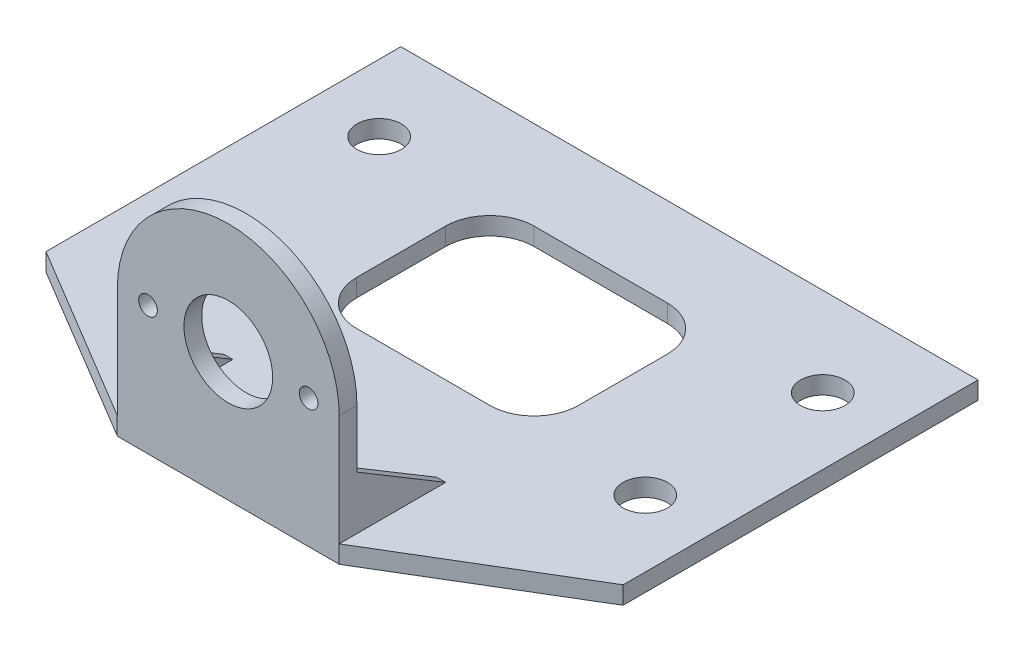
ISO-10303-21;
HEADER;
FILE_DESCRIPTION(('STEP AP214'),'2;1');
FILE_NAME('part.step','',(''),(''),'','','');
FILE_SCHEMA(('AUTOMOTIVE_DESIGN { 1 0 10303 214 1 1 1 1 }'));
ENDSEC;
DATA;
#1=APPLICATION_CONTEXT('core data for automotive mechanical design processes');
#2=APPLICATION_PROTOCOL_DEFINITION('international standard','automotive_design',2000,#1);
#3=PRODUCT_CONTEXT('',#1,'mechanical');
#4=PRODUCT('Part','Part','',(#3));
#5=PRODUCT_RELATED_PRODUCT_CATEGORY('part','',(#4));
#6=PRODUCT_DEFINITION_FORMATION('','',#4);
#7=PRODUCT_DEFINITION_CONTEXT('part definition',#1,'design');
#8=PRODUCT_DEFINITION('design','',#6,#7);
#9=PRODUCT_DEFINITION_SHAPE('','',#8);
#10=(LENGTH_UNIT() NAMED_UNIT(*) SI_UNIT(.MILLI.,.METRE.));
#11=(NAMED_UNIT(*) PLANE_ANGLE_UNIT() SI_UNIT($,.RADIAN.));
#12=(NAMED_UNIT(*) SI_UNIT($,.STERADIAN.) SOLID_ANGLE_UNIT());
#13=UNCERTAINTY_MEASURE_WITH_UNIT(LENGTH_MEASURE(1.E-05),#10,'distance_accuracy_value','');
#14=(GEOMETRIC_REPRESENTATION_CONTEXT(3) GLOBAL_UNCERTAINTY_ASSIGNED_CONTEXT((#13)) GLOBAL_UNIT_ASSIGNED_CONTEXT((#10,
#11,#12)) REPRESENTATION_CONTEXT('',''));
#15=CARTESIAN_POINT('',(0.,0.,0.));
#16=DIRECTION('',(0.,0.,1.));
#17=DIRECTION('',(1.,0.,0.));
#18=AXIS2_PLACEMENT_3D('',#15,#16,#17);
#19=CARTESIAN_POINT('',(0.,0.,0.));
#20=DIRECTION('',(0.,0.,1.));
#21=DIRECTION('',(1.,0.,0.));
#22=AXIS2_PLACEMENT_3D('',#19,#20,#21);
#23=PLANE('',#22);
#24=DIRECTION('',(0.,-1.,0.));
#25=VECTOR('',#24,1.);
#26=CARTESIAN_POINT('',(-11.5,-12.5,0.));
#27=LINE('',#26,#25);
#28=CARTESIAN_POINT('',(-11.5,-6.5,0.));
#29=VERTEX_POINT('',#28);
#30=CARTESIAN_POINT('',(-11.5,-12.5,0.));
#31=VERTEX_POINT('',#30);
#32=EDGE_CURVE('E278',#29,#31,#27,.T.);
#33=ORIENTED_EDGE('',*,*,#32,.F.);
#34=DIRECTION('',(1.,0.,0.));
#35=VECTOR('',#34,1.);
#36=CARTESIAN_POINT('',(-12.5,-6.5,0.));
#37=LINE('',#36,#35);
#38=CARTESIAN_POINT('',(-12.5,-6.5,0.));
#39=VERTEX_POINT('',#38);
#40=EDGE_CURVE('E273',#39,#29,#37,.T.);
#41=ORIENTED_EDGE('',*,*,#40,.F.);
#42=DIRECTION('',(0.,-1.,0.));
#43=VECTOR('',#42,1.);
#44=CARTESIAN_POINT('',(-12.5,0.,0.));
#45=LINE('',#44,#43);
#46=CARTESIAN_POINT('',(-12.5,0.,0.));
#47=VERTEX_POINT('',#46);
#48=EDGE_CURVE('E358',#47,#39,#45,.T.);
#49=ORIENTED_EDGE('',*,*,#48,.F.);
#50=CARTESIAN_POINT('',(0.,0.,0.));
#51=DIRECTION('',(0.,0.,1.));
#52=DIRECTION('',(1.,0.,0.));
#53=AXIS2_PLACEMENT_3D('',#50,#51,#52);
#54=CIRCLE('',#53,12.5);
#55=CARTESIAN_POINT('',(12.5,0.,0.));
#56=VERTEX_POINT('',#55);
#57=EDGE_CURVE('E380',#56,#47,#54,.T.);
#58=ORIENTED_EDGE('',*,*,#57,.F.);
#59=DIRECTION('',(0.,1.,0.));
#60=VECTOR('',#59,1.);
#61=CARTESIAN_POINT('',(12.5,0.,0.));
#62=LINE('',#61,#60);
#63=CARTESIAN_POINT('',(12.5,-6.5,0.));
#64=VERTEX_POINT('',#63);
#65=EDGE_CURVE('E370',#64,#56,#62,.T.);
#66=ORIENTED_EDGE('',*,*,#65,.F.);
#67=DIRECTION('',(1.,0.,0.));
#68=VECTOR('',#67,1.);
#69=CARTESIAN_POINT('',(12.5,-6.5,0.));
#70=LINE('',#69,#68);
#71=CARTESIAN_POINT('',(11.5,-6.5,0.));
#72=VERTEX_POINT('',#71);
#73=EDGE_CURVE('E268',#72,#64,#70,.T.);
#74=ORIENTED_EDGE('',*,*,#73,.F.);
#75=DIRECTION('',(0.,1.,0.));
#76=VECTOR('',#75,1.);
#77=CARTESIAN_POINT('',(11.5,-12.5,0.));
#78=LINE('',#77,#76);
#79=CARTESIAN_POINT('',(11.5,-12.5,0.));
#80=VERTEX_POINT('',#79);
#81=EDGE_CURVE('E263',#80,#72,#78,.T.);
#82=ORIENTED_EDGE('',*,*,#81,.F.);
#83=DIRECTION('',(1.,0.,0.));
#84=VECTOR('',#83,1.);
#85=CARTESIAN_POINT('',(0.,-12.5,0.));
#86=LINE('',#85,#84);
#87=EDGE_CURVE('E366',#31,#80,#86,.T.);
#88=ORIENTED_EDGE('',*,*,#87,.F.);
#89=EDGE_LOOP('',(#33,#41,#49,#58,#66,#74,#82,#88));
#90=FACE_BOUND('',#89,.T.);
#91=CARTESIAN_POINT('',(0.,0.,0.));
#92=DIRECTION('',(0.,0.,1.));
#93=DIRECTION('',(1.,0.,0.));
#94=AXIS2_PLACEMENT_3D('',#91,#92,#93);
#95=CIRCLE('',#94,5.);
#96=CARTESIAN_POINT('',(5.,0.,0.));
#97=VERTEX_POINT('',#96);
#98=EDGE_CURVE('E496',#97,#97,#95,.T.);
#99=ORIENTED_EDGE('',*,*,#98,.T.);
#100=EDGE_LOOP('',(#99));
#101=FACE_BOUND('',#100,.T.);
#102=CARTESIAN_POINT('',(-9.05,0.,0.));
#103=DIRECTION('',(0.,0.,1.));
#104=DIRECTION('',(1.,0.,0.));
#105=AXIS2_PLACEMENT_3D('',#102,#103,#104);
#106=CIRCLE('',#105,1.05);
#107=CARTESIAN_POINT('',(-8.,0.,0.));
#108=VERTEX_POINT('',#107);
#109=EDGE_CURVE('E482',#108,#108,#106,.T.);
#110=ORIENTED_EDGE('',*,*,#109,.T.);
#111=EDGE_LOOP('',(#110));
#112=FACE_BOUND('',#111,.T.);
#113=CARTESIAN_POINT('',(9.05,0.,0.));
#114=DIRECTION('',(0.,0.,1.));
#115=DIRECTION('',(1.,0.,0.));
#116=AXIS2_PLACEMENT_3D('',#113,#114,#115);
#117=CIRCLE('',#116,1.05);
#118=CARTESIAN_POINT('',(10.1,0.,0.));
#119=VERTEX_POINT('',#118);
#120=EDGE_CURVE('E490',#119,#119,#117,.T.);
#121=ORIENTED_EDGE('',*,*,#120,.T.);
#122=EDGE_LOOP('',(#121));
#123=FACE_BOUND('',#122,.T.);
#124=ADVANCED_FACE('F52',(#90,#101,#112,#123),#23,.F.);
#125=CARTESIAN_POINT('',(12.5,-12.5,2.));
#126=DIRECTION('',(0.,1.,0.));
#127=DIRECTION('',(0.,0.,1.));
#128=AXIS2_PLACEMENT_3D('',#125,#126,#127);
#129=PLANE('',#128);
#130=CARTESIAN_POINT('',(-7.52457031976064,-12.5,-35.));
#131=DIRECTION('',(0.,1.,0.));
#132=DIRECTION('',(0.,0.,-1.));
#133=AXIS2_PLACEMENT_3D('',#130,#131,#132);
#134=CIRCLE('',#133,5.);
#135=CARTESIAN_POINT('',(-7.52457031976061,-12.5,-40.));
#136=VERTEX_POINT('',#135);
#137=CARTESIAN_POINT('',(-12.5245703197606,-12.5,-35.));
#138=VERTEX_POINT('',#137);
#139=EDGE_CURVE('E67',#136,#138,#134,.T.);
#140=ORIENTED_EDGE('',*,*,#139,.F.);
#141=DIRECTION('',(-1.,0.,0.));
#142=VECTOR('',#141,1.);
#143=CARTESIAN_POINT('',(7.47542968023932,-12.5,-40.));
#144=LINE('',#143,#142);
#145=CARTESIAN_POINT('',(7.47542968023932,-12.5,-40.));
#146=VERTEX_POINT('',#145);
#147=EDGE_CURVE('E237',#146,#136,#144,.T.);
#148=ORIENTED_EDGE('',*,*,#147,.F.);
#149=CARTESIAN_POINT('',(7.47542968023936,-12.5,-35.));
#150=DIRECTION('',(0.,1.,0.));
#151=DIRECTION('',(0.,0.,1.));
#152=AXIS2_PLACEMENT_3D('',#149,#150,#151);
#153=CIRCLE('',#152,5.);
#154=CARTESIAN_POINT('',(12.4754296802394,-12.5,-35.));
#155=VERTEX_POINT('',#154);
#156=EDGE_CURVE('E234',#155,#146,#153,.T.);
#157=ORIENTED_EDGE('',*,*,#156,.F.);
#158=DIRECTION('',(0.,0.,-1.));
#159=VECTOR('',#158,1.);
#160=CARTESIAN_POINT('',(12.4754296802394,-12.5,-35.));
#161=LINE('',#160,#159);
#162=CARTESIAN_POINT('',(12.4754296802394,-12.5,-25.));
#163=VERTEX_POINT('',#162);
#164=EDGE_CURVE('E231',#163,#155,#161,.T.);
#165=ORIENTED_EDGE('',*,*,#164,.F.);
#166=CARTESIAN_POINT('',(7.47542968023936,-12.5,-25.));
#167=DIRECTION('',(0.,1.,0.));
#168=DIRECTION('',(0.,0.,1.));
#169=AXIS2_PLACEMENT_3D('',#166,#167,#168);
#170=CIRCLE('',#169,5.);
#171=CARTESIAN_POINT('',(7.47542968023933,-12.5,-20.));
#172=VERTEX_POINT('',#171);
#173=EDGE_CURVE('E225',#172,#163,#170,.T.);
#174=ORIENTED_EDGE('',*,*,#173,.F.);
#175=DIRECTION('',(1.,0.,0.));
#176=VECTOR('',#175,1.);
#177=CARTESIAN_POINT('',(7.47542968023933,-12.5,-20.));
#178=LINE('',#177,#176);
#179=CARTESIAN_POINT('',(-7.5245703197606,-12.5,-20.));
#180=VERTEX_POINT('',#179);
#181=EDGE_CURVE('E223',#180,#172,#178,.T.);
#182=ORIENTED_EDGE('',*,*,#181,.F.);
#183=CARTESIAN_POINT('',(-7.52457031976064,-12.5,-25.));
#184=DIRECTION('',(0.,1.,0.));
#185=DIRECTION('',(0.,0.,-1.));
#186=AXIS2_PLACEMENT_3D('',#183,#184,#185);
#187=CIRCLE('',#186,5.);
#188=CARTESIAN_POINT('',(-12.5245703197606,-12.5,-25.));
#189=VERTEX_POINT('',#188);
#190=EDGE_CURVE('E206',#189,#180,#187,.T.);
#191=ORIENTED_EDGE('',*,*,#190,.F.);
#192=DIRECTION('',(0.,0.,1.));
#193=VECTOR('',#192,1.);
#194=CARTESIAN_POINT('',(-12.5245703197606,-12.5,-35.));
#195=LINE('',#194,#193);
#196=EDGE_CURVE('E215',#138,#189,#195,.T.);
#197=ORIENTED_EDGE('',*,*,#196,.F.);
#198=EDGE_LOOP('',(#140,#148,#157,#165,#174,#182,#191,#197));
#199=FACE_BOUND('',#198,.T.);
#200=DIRECTION('',(0.857492925712544,0.,-0.514495755427526));
#201=VECTOR('',#200,1.);
#202=CARTESIAN_POINT('',(12.5,-12.5,2.));
#203=LINE('',#202,#201);
#204=CARTESIAN_POINT('',(12.5,-12.5,2.));
#205=VERTEX_POINT('',#204);
#206=CARTESIAN_POINT('',(32.5,-12.5,-10.));
#207=VERTEX_POINT('',#206);
#208=EDGE_CURVE('E310',#205,#207,#203,.T.);
#209=ORIENTED_EDGE('',*,*,#208,.T.);
#210=DIRECTION('',(0.,0.,-1.));
#211=VECTOR('',#210,1.);
#212=CARTESIAN_POINT('',(32.5,-12.5,-50.));
#213=LINE('',#212,#211);
#214=CARTESIAN_POINT('',(32.5,-12.5,-50.));
#215=VERTEX_POINT('',#214);
#216=EDGE_CURVE('E304',#207,#215,#213,.T.);
#217=ORIENTED_EDGE('',*,*,#216,.T.);
#218=DIRECTION('',(1.,0.,0.));
#219=VECTOR('',#218,1.);
#220=CARTESIAN_POINT('',(12.5,-12.5,-50.));
#221=LINE('',#220,#219);
#222=CARTESIAN_POINT('',(-32.5491406395213,-12.5,-50.));
#223=VERTEX_POINT('',#222);
#224=EDGE_CURVE('E338',#223,#215,#221,.T.);
#225=ORIENTED_EDGE('',*,*,#224,.F.);
#226=DIRECTION('',(0.,0.,1.));
#227=VECTOR('',#226,1.);
#228=CARTESIAN_POINT('',(-32.5491406395213,-12.5,-50.));
#229=LINE('',#228,#227);
#230=CARTESIAN_POINT('',(-32.5491406395213,-12.5,-10.));
#231=VERTEX_POINT('',#230);
#232=EDGE_CURVE('E324',#223,#231,#229,.T.);
#233=ORIENTED_EDGE('',*,*,#232,.T.);
#234=DIRECTION('',(0.858049123183599,0.,0.513567621841424));
#235=VECTOR('',#234,1.);
#236=CARTESIAN_POINT('',(-12.5,-12.5,2.));
#237=LINE('',#236,#235);
#238=CARTESIAN_POINT('',(-12.5491406395213,-12.5,1.97058788279968));
#239=VERTEX_POINT('',#238);
#240=EDGE_CURVE('E321',#231,#239,#237,.T.);
#241=ORIENTED_EDGE('',*,*,#240,.T.);
#242=DIRECTION('',(0.,0.,-1.));
#243=VECTOR('',#242,1.);
#244=CARTESIAN_POINT('',(-12.5491406395213,-12.5,2.));
#245=LINE('',#244,#243);
#246=CARTESIAN_POINT('',(-12.5491406395213,-12.5,2.));
#247=VERTEX_POINT('',#246);
#248=EDGE_CURVE('E348',#247,#239,#245,.T.);
#249=ORIENTED_EDGE('',*,*,#248,.F.);
#250=DIRECTION('',(1.,0.,0.));
#251=VECTOR('',#250,1.);
#252=CARTESIAN_POINT('',(12.5,-12.5,2.));
#253=LINE('',#252,#251);
#254=CARTESIAN_POINT('',(-12.5,-12.5,2.));
#255=VERTEX_POINT('',#254);
#256=EDGE_CURVE('E345',#247,#255,#253,.T.);
#257=ORIENTED_EDGE('',*,*,#256,.T.);
#258=DIRECTION('',(0.,0.,1.));
#259=VECTOR('',#258,1.);
#260=CARTESIAN_POINT('',(-12.5,-12.5,0.));
#261=LINE('',#260,#259);
#262=CARTESIAN_POINT('',(-12.5,-12.5,-10.));
#263=VERTEX_POINT('',#262);
#264=EDGE_CURVE('E357',#263,#255,#261,.T.);
#265=ORIENTED_EDGE('',*,*,#264,.F.);
#266=DIRECTION('',(-1.,0.,0.));
#267=VECTOR('',#266,1.);
#268=CARTESIAN_POINT('',(-12.5,-12.5,-10.));
#269=LINE('',#268,#267);
#270=CARTESIAN_POINT('',(-11.5,-12.5,-10.));
#271=VERTEX_POINT('',#270);
#272=EDGE_CURVE('E274',#271,#263,#269,.T.);
#273=ORIENTED_EDGE('',*,*,#272,.F.);
#274=DIRECTION('',(0.,0.,1.));
#275=VECTOR('',#274,1.);
#276=CARTESIAN_POINT('',(-11.5,-12.5,-10.));
#277=LINE('',#276,#275);
#278=EDGE_CURVE('E277',#271,#31,#277,.T.);
#279=ORIENTED_EDGE('',*,*,#278,.T.);
#280=ORIENTED_EDGE('',*,*,#87,.T.);
#281=DIRECTION('',(0.,0.,1.));
#282=VECTOR('',#281,1.);
#283=CARTESIAN_POINT('',(11.5,-12.5,-10.));
#284=LINE('',#283,#282);
#285=CARTESIAN_POINT('',(11.5,-12.5,-10.));
#286=VERTEX_POINT('',#285);
#287=EDGE_CURVE('E267',#286,#80,#284,.T.);
#288=ORIENTED_EDGE('',*,*,#287,.F.);
#289=DIRECTION('',(-1.,0.,0.));
#290=VECTOR('',#289,1.);
#291=CARTESIAN_POINT('',(12.5,-12.5,-10.));
#292=LINE('',#291,#290);
#293=CARTESIAN_POINT('',(12.5,-12.5,-10.));
#294=VERTEX_POINT('',#293);
#295=EDGE_CURVE('E264',#294,#286,#292,.T.);
#296=ORIENTED_EDGE('',*,*,#295,.F.);
#297=DIRECTION('',(0.,0.,1.));
#298=VECTOR('',#297,1.);
#299=CARTESIAN_POINT('',(12.5,-12.5,2.));
#300=LINE('',#299,#298);
#301=EDGE_CURVE('E313',#294,#205,#300,.T.);
#302=ORIENTED_EDGE('',*,*,#301,.T.);
#303=EDGE_LOOP('',(#209,#217,#225,#233,#241,#249,#257,#265,#273,#279,#280,#288,#296,#302));
#304=FACE_BOUND('',#303,.T.);
#305=CARTESIAN_POINT('',(-25.,-12.5,-20.));
#306=DIRECTION('',(0.,1.,0.));
#307=DIRECTION('',(0.,0.,1.));
#308=AXIS2_PLACEMENT_3D('',#305,#306,#307);
#309=CIRCLE('',#308,2.5);
#310=CARTESIAN_POINT('',(-25.,-12.5,-17.5));
#311=VERTEX_POINT('',#310);
#312=EDGE_CURVE('E296',#311,#311,#309,.T.);
#313=ORIENTED_EDGE('',*,*,#312,.F.);
#314=EDGE_LOOP('',(#313));
#315=FACE_BOUND('',#314,.T.);
#316=CARTESIAN_POINT('',(-25.,-12.5,-40.));
#317=DIRECTION('',(0.,1.,0.));
#318=DIRECTION('',(0.,0.,1.));
#319=AXIS2_PLACEMENT_3D('',#316,#317,#318);
#320=CIRCLE('',#319,2.5);
#321=CARTESIAN_POINT('',(-25.,-12.5,-37.5));
#322=VERTEX_POINT('',#321);
#323=EDGE_CURVE('E292',#322,#322,#320,.T.);
#324=ORIENTED_EDGE('',*,*,#323,.F.);
#325=EDGE_LOOP('',(#324));
#326=FACE_BOUND('',#325,.T.);
#327=CARTESIAN_POINT('',(25.,-12.5,-40.));
#328=DIRECTION('',(0.,1.,0.));
#329=DIRECTION('',(0.,0.,-1.));
#330=AXIS2_PLACEMENT_3D('',#327,#328,#329);
#331=CIRCLE('',#330,2.5);
#332=CARTESIAN_POINT('',(25.,-12.5,-42.5));
#333=VERTEX_POINT('',#332);
#334=EDGE_CURVE('E288',#333,#333,#331,.T.);
#335=ORIENTED_EDGE('',*,*,#334,.F.);
#336=EDGE_LOOP('',(#335));
#337=FACE_BOUND('',#336,.T.);
#338=CARTESIAN_POINT('',(25.,-12.5,-20.));
#339=DIRECTION('',(0.,1.,0.));
#340=DIRECTION('',(0.,0.,-1.));
#341=AXIS2_PLACEMENT_3D('',#338,#339,#340);
#342=CIRCLE('',#341,2.5);
#343=CARTESIAN_POINT('',(25.,-12.5,-22.5));
#344=VERTEX_POINT('',#343);
#345=EDGE_CURVE('E284',#344,#344,#342,.T.);
#346=ORIENTED_EDGE('',*,*,#345,.F.);
#347=EDGE_LOOP('',(#346));
#348=FACE_BOUND('',#347,.T.);
#349=ADVANCED_FACE('F219',(#199,#304,#315,#326,#337,#348),#129,.T.);
#350=CARTESIAN_POINT('',(12.5,0.,0.));
#351=DIRECTION('',(1.,0.,0.));
#352=DIRECTION('',(0.,0.,-1.));
#353=AXIS2_PLACEMENT_3D('',#350,#351,#352);
#354=PLANE('',#353);
#355=DIRECTION('',(0.,-0.514495755427526,-0.857492925712544));
#356=VECTOR('',#355,1.);
#357=CARTESIAN_POINT('',(12.5,-4.77941176470588,2.86764705882353));
#358=LINE('',#357,#356);
#359=EDGE_CURVE('E260',#64,#294,#358,.T.);
#360=ORIENTED_EDGE('',*,*,#359,.F.);
#361=ORIENTED_EDGE('',*,*,#65,.T.);
#362=DIRECTION('',(0.,0.,1.));
#363=VECTOR('',#362,1.);
#364=CARTESIAN_POINT('',(12.5,0.,0.));
#365=LINE('',#364,#363);
#366=CARTESIAN_POINT('',(12.5,0.,2.));
#367=VERTEX_POINT('',#366);
#368=EDGE_CURVE('E374',#56,#367,#365,.T.);
#369=ORIENTED_EDGE('',*,*,#368,.T.);
#370=DIRECTION('',(0.,1.,0.));
#371=VECTOR('',#370,1.);
#372=CARTESIAN_POINT('',(12.5,0.,2.));
#373=LINE('',#372,#371);
#374=EDGE_CURVE('E387',#205,#367,#373,.T.);
#375=ORIENTED_EDGE('',*,*,#374,.F.);
#376=ORIENTED_EDGE('',*,*,#301,.F.);
#377=EDGE_LOOP('',(#360,#361,#369,#375,#376));
#378=FACE_BOUND('',#377,.T.);
#379=ADVANCED_FACE('F476',(#378),#354,.T.);
#380=CARTESIAN_POINT('',(0.,0.,2.));
#381=DIRECTION('',(0.,0.,-1.));
#382=DIRECTION('',(-1.,0.,0.));
#383=AXIS2_PLACEMENT_3D('',#380,#381,#382);
#384=CYLINDRICAL_SURFACE('',#383,12.5);
#385=DIRECTION('',(0.,0.,1.));
#386=VECTOR('',#385,1.);
#387=CARTESIAN_POINT('',(-12.5,0.,0.));
#388=LINE('',#387,#386);
#389=CARTESIAN_POINT('',(-12.5,0.,2.));
#390=VERTEX_POINT('',#389);
#391=EDGE_CURVE('E354',#47,#390,#388,.T.);
#392=ORIENTED_EDGE('',*,*,#391,.T.);
#393=CARTESIAN_POINT('',(0.,0.,2.));
#394=DIRECTION('',(0.,0.,1.));
#395=DIRECTION('',(1.,0.,0.));
#396=AXIS2_PLACEMENT_3D('',#393,#394,#395);
#397=CIRCLE('',#396,12.5);
#398=EDGE_CURVE('E449',#367,#390,#397,.T.);
#399=ORIENTED_EDGE('',*,*,#398,.F.);
#400=ORIENTED_EDGE('',*,*,#368,.F.);
#401=ORIENTED_EDGE('',*,*,#57,.T.);
#402=EDGE_LOOP('',(#392,#399,#400,#401));
#403=FACE_BOUND('',#402,.T.);
#404=ADVANCED_FACE('F54',(#403),#384,.T.);
#405=CARTESIAN_POINT('',(0.,0.,2.));
#406=DIRECTION('',(0.,0.,1.));
#407=DIRECTION('',(1.,0.,0.));
#408=AXIS2_PLACEMENT_3D('',#405,#406,#407);
#409=PLANE('',#408);
#410=DIRECTION('',(0.,1.,0.));
#411=VECTOR('',#410,1.);
#412=CARTESIAN_POINT('',(-12.5491406395213,-12.5,2.));
#413=LINE('',#412,#411);
#414=CARTESIAN_POINT('',(-12.5491406395213,-14.5,2.));
#415=VERTEX_POINT('',#414);
#416=EDGE_CURVE('E342',#415,#247,#413,.T.);
#417=ORIENTED_EDGE('',*,*,#416,.F.);
#418=DIRECTION('',(-1.,0.,0.));
#419=VECTOR('',#418,1.);
#420=CARTESIAN_POINT('',(12.5,-14.5,2.));
#421=LINE('',#420,#419);
#422=CARTESIAN_POINT('',(12.5,-14.5,2.));
#423=VERTEX_POINT('',#422);
#424=EDGE_CURVE('E340',#423,#415,#421,.T.);
#425=ORIENTED_EDGE('',*,*,#424,.F.);
#426=EDGE_CURVE('E363',#423,#205,#373,.T.);
#427=ORIENTED_EDGE('',*,*,#426,.T.);
#428=ORIENTED_EDGE('',*,*,#374,.T.);
#429=ORIENTED_EDGE('',*,*,#398,.T.);
#430=DIRECTION('',(0.,-1.,0.));
#431=VECTOR('',#430,1.);
#432=CARTESIAN_POINT('',(-12.5,0.,2.));
#433=LINE('',#432,#431);
#434=EDGE_CURVE('E356',#390,#255,#433,.T.);
#435=ORIENTED_EDGE('',*,*,#434,.T.);
#436=ORIENTED_EDGE('',*,*,#256,.F.);
#437=EDGE_LOOP('',(#417,#425,#427,#428,#429,#435,#436));
#438=FACE_BOUND('',#437,.T.);
#439=CARTESIAN_POINT('',(0.,0.,2.));
#440=DIRECTION('',(0.,0.,1.));
#441=DIRECTION('',(1.,0.,0.));
#442=AXIS2_PLACEMENT_3D('',#439,#440,#441);
#443=CIRCLE('',#442,5.);
#444=CARTESIAN_POINT('',(5.,0.,2.));
#445=VERTEX_POINT('',#444);
#446=EDGE_CURVE('E493',#445,#445,#443,.T.);
#447=ORIENTED_EDGE('',*,*,#446,.F.);
#448=EDGE_LOOP('',(#447));
#449=FACE_BOUND('',#448,.T.);
#450=CARTESIAN_POINT('',(-9.05,0.,2.));
#451=DIRECTION('',(0.,0.,1.));
#452=DIRECTION('',(1.,0.,0.));
#453=AXIS2_PLACEMENT_3D('',#450,#451,#452);
#454=CIRCLE('',#453,1.05);
#455=CARTESIAN_POINT('',(-8.,0.,2.));
#456=VERTEX_POINT('',#455);
#457=EDGE_CURVE('E480',#456,#456,#454,.T.);
#458=ORIENTED_EDGE('',*,*,#457,.F.);
#459=EDGE_LOOP('',(#458));
#460=FACE_BOUND('',#459,.T.);
#461=CARTESIAN_POINT('',(9.05,0.,2.));
#462=DIRECTION('',(0.,0.,1.));
#463=DIRECTION('',(1.,0.,0.));
#464=AXIS2_PLACEMENT_3D('',#461,#462,#463);
#465=CIRCLE('',#464,1.05);
#466=CARTESIAN_POINT('',(10.1,0.,2.));
#467=VERTEX_POINT('',#466);
#468=EDGE_CURVE('E487',#467,#467,#465,.T.);
#469=ORIENTED_EDGE('',*,*,#468,.F.);
#470=EDGE_LOOP('',(#469));
#471=FACE_BOUND('',#470,.T.);
#472=ADVANCED_FACE('F444',(#438,#449,#460,#471),#409,.T.);
#473=CARTESIAN_POINT('',(-9.05,0.,2.));
#474=DIRECTION('',(0.,0.,-1.));
#475=DIRECTION('',(-1.,0.,0.));
#476=AXIS2_PLACEMENT_3D('',#473,#474,#475);
#477=CYLINDRICAL_SURFACE('',#476,1.05);
#478=ORIENTED_EDGE('',*,*,#457,.T.);
#479=EDGE_LOOP('',(#478));
#480=FACE_BOUND('',#479,.T.);
#481=ORIENTED_EDGE('',*,*,#109,.F.);
#482=EDGE_LOOP('',(#481));
#483=FACE_BOUND('',#482,.T.);
#484=ADVANCED_FACE('F505',(#480,#483),#477,.F.);
#485=CARTESIAN_POINT('',(9.05,0.,2.));
#486=DIRECTION('',(0.,0.,-1.));
#487=DIRECTION('',(-1.,0.,0.));
#488=AXIS2_PLACEMENT_3D('',#485,#486,#487);
#489=CYLINDRICAL_SURFACE('',#488,1.05);
#490=ORIENTED_EDGE('',*,*,#468,.T.);
#491=EDGE_LOOP('',(#490));
#492=FACE_BOUND('',#491,.T.);
#493=ORIENTED_EDGE('',*,*,#120,.F.);
#494=EDGE_LOOP('',(#493));
#495=FACE_BOUND('',#494,.T.);
#496=ADVANCED_FACE('F517',(#492,#495),#489,.F.);
#497=CARTESIAN_POINT('',(0.,0.,2.));
#498=DIRECTION('',(0.,0.,-1.));
#499=DIRECTION('',(-1.,0.,0.));
#500=AXIS2_PLACEMENT_3D('',#497,#498,#499);
#501=CYLINDRICAL_SURFACE('',#500,5.);
#502=ORIENTED_EDGE('',*,*,#446,.T.);
#503=EDGE_LOOP('',(#502));
#504=FACE_BOUND('',#503,.T.);
#505=ORIENTED_EDGE('',*,*,#98,.F.);
#506=EDGE_LOOP('',(#505));
#507=FACE_BOUND('',#506,.T.);
#508=ADVANCED_FACE('F520',(#504,#507),#501,.F.);
#509=CARTESIAN_POINT('',(-12.5,0.,0.));
#510=DIRECTION('',(-1.,0.,0.));
#511=DIRECTION('',(0.,0.,1.));
#512=AXIS2_PLACEMENT_3D('',#509,#510,#511);
#513=PLANE('',#512);
#514=DIRECTION('',(0.,0.514495755427526,0.857492925712544));
#515=VECTOR('',#514,1.);
#516=CARTESIAN_POINT('',(-12.5,-4.77941176470588,2.86764705882353));
#517=LINE('',#516,#515);
#518=EDGE_CURVE('E257',#263,#39,#517,.T.);
#519=ORIENTED_EDGE('',*,*,#518,.F.);
#520=ORIENTED_EDGE('',*,*,#264,.T.);
#521=ORIENTED_EDGE('',*,*,#434,.F.);
#522=ORIENTED_EDGE('',*,*,#391,.F.);
#523=ORIENTED_EDGE('',*,*,#48,.T.);
#524=EDGE_LOOP('',(#519,#520,#521,#522,#523));
#525=FACE_BOUND('',#524,.T.);
#526=ADVANCED_FACE('F453',(#525),#513,.T.);
#527=CARTESIAN_POINT('',(-12.5491406395213,-12.5,2.));
#528=DIRECTION('',(-1.,0.,0.));
#529=DIRECTION('',(0.,0.,1.));
#530=AXIS2_PLACEMENT_3D('',#527,#528,#529);
#531=PLANE('',#530);
#532=DIRECTION('',(0.,1.,0.));
#533=VECTOR('',#532,1.);
#534=CARTESIAN_POINT('',(-12.5491406395213,-12.5,1.97058788279968));
#535=LINE('',#534,#533);
#536=CARTESIAN_POINT('',(-12.5491406395213,-14.5,1.97058788279968));
#537=VERTEX_POINT('',#536);
#538=EDGE_CURVE('E332',#537,#239,#535,.T.);
#539=ORIENTED_EDGE('',*,*,#538,.F.);
#540=DIRECTION('',(0.,0.,-1.));
#541=VECTOR('',#540,1.);
#542=CARTESIAN_POINT('',(-12.5491406395213,-14.5,2.));
#543=LINE('',#542,#541);
#544=EDGE_CURVE('E353',#415,#537,#543,.T.);
#545=ORIENTED_EDGE('',*,*,#544,.F.);
#546=ORIENTED_EDGE('',*,*,#416,.T.);
#547=ORIENTED_EDGE('',*,*,#248,.T.);
#548=EDGE_LOOP('',(#539,#545,#546,#547));
#549=FACE_BOUND('',#548,.T.);
#550=ADVANCED_FACE('F403',(#549),#531,.T.);
#551=CARTESIAN_POINT('',(12.5,-14.5,2.));
#552=DIRECTION('',(0.,-1.,0.));
#553=DIRECTION('',(0.,0.,-1.));
#554=AXIS2_PLACEMENT_3D('',#551,#552,#553);
#555=PLANE('',#554);
#556=CARTESIAN_POINT('',(-7.52457031976064,-14.5,-35.));
#557=DIRECTION('',(0.,-1.,0.));
#558=DIRECTION('',(0.,0.,-1.));
#559=AXIS2_PLACEMENT_3D('',#556,#557,#558);
#560=CIRCLE('',#559,5.);
#561=CARTESIAN_POINT('',(-12.5245703197606,-14.5,-35.));
#562=VERTEX_POINT('',#561);
#563=CARTESIAN_POINT('',(-7.52457031976061,-14.5,-40.));
#564=VERTEX_POINT('',#563);
#565=EDGE_CURVE('E12',#562,#564,#560,.T.);
#566=ORIENTED_EDGE('',*,*,#565,.F.);
#567=DIRECTION('',(0.,0.,-1.));
#568=VECTOR('',#567,1.);
#569=CARTESIAN_POINT('',(-12.5245703197606,-14.5,2.));
#570=LINE('',#569,#568);
#571=CARTESIAN_POINT('',(-12.5245703197606,-14.5,-25.));
#572=VERTEX_POINT('',#571);
#573=EDGE_CURVE('E375',#572,#562,#570,.T.);
#574=ORIENTED_EDGE('',*,*,#573,.F.);
#575=CARTESIAN_POINT('',(-7.52457031976064,-14.5,-25.));
#576=DIRECTION('',(0.,-1.,0.));
#577=DIRECTION('',(0.,0.,-1.));
#578=AXIS2_PLACEMENT_3D('',#575,#576,#577);
#579=CIRCLE('',#578,5.);
#580=CARTESIAN_POINT('',(-7.5245703197606,-14.5,-20.));
#581=VERTEX_POINT('',#580);
#582=EDGE_CURVE('E209',#581,#572,#579,.T.);
#583=ORIENTED_EDGE('',*,*,#582,.F.);
#584=DIRECTION('',(-1.,0.,0.));
#585=VECTOR('',#584,1.);
#586=CARTESIAN_POINT('',(12.5,-14.5,-20.));
#587=LINE('',#586,#585);
#588=CARTESIAN_POINT('',(7.47542968023933,-14.5,-20.));
#589=VERTEX_POINT('',#588);
#590=EDGE_CURVE('E605',#589,#581,#587,.T.);
#591=ORIENTED_EDGE('',*,*,#590,.F.);
#592=CARTESIAN_POINT('',(7.47542968023936,-14.5,-25.));
#593=DIRECTION('',(0.,-1.,0.));
#594=DIRECTION('',(0.,0.,-1.));
#595=AXIS2_PLACEMENT_3D('',#592,#593,#594);
#596=CIRCLE('',#595,5.);
#597=CARTESIAN_POINT('',(12.4754296802394,-14.5,-25.));
#598=VERTEX_POINT('',#597);
#599=EDGE_CURVE('E601',#598,#589,#596,.T.);
#600=ORIENTED_EDGE('',*,*,#599,.F.);
#601=DIRECTION('',(0.,0.,1.));
#602=VECTOR('',#601,1.);
#603=CARTESIAN_POINT('',(12.4754296802394,-14.5,2.));
#604=LINE('',#603,#602);
#605=CARTESIAN_POINT('',(12.4754296802394,-14.5,-35.));
#606=VERTEX_POINT('',#605);
#607=EDGE_CURVE('E599',#606,#598,#604,.T.);
#608=ORIENTED_EDGE('',*,*,#607,.F.);
#609=CARTESIAN_POINT('',(7.47542968023936,-14.5,-35.));
#610=DIRECTION('',(0.,-1.,0.));
#611=DIRECTION('',(0.,0.,-1.));
#612=AXIS2_PLACEMENT_3D('',#609,#610,#611);
#613=CIRCLE('',#612,5.);
#614=CARTESIAN_POINT('',(7.47542968023932,-14.5,-40.));
#615=VERTEX_POINT('',#614);
#616=EDGE_CURVE('E592',#615,#606,#613,.T.);
#617=ORIENTED_EDGE('',*,*,#616,.F.);
#618=DIRECTION('',(1.,0.,0.));
#619=VECTOR('',#618,1.);
#620=CARTESIAN_POINT('',(12.5,-14.5,-40.));
#621=LINE('',#620,#619);
#622=EDGE_CURVE('E60',#564,#615,#621,.T.);
#623=ORIENTED_EDGE('',*,*,#622,.F.);
#624=EDGE_LOOP('',(#566,#574,#583,#591,#600,#608,#617,#623));
#625=FACE_BOUND('',#624,.T.);
#626=CARTESIAN_POINT('',(25.,-14.5,-20.));
#627=DIRECTION('',(0.,-1.,0.));
#628=DIRECTION('',(0.,0.,-1.));
#629=AXIS2_PLACEMENT_3D('',#626,#627,#628);
#630=CIRCLE('',#629,2.5);
#631=CARTESIAN_POINT('',(25.,-14.5,-22.5));
#632=VERTEX_POINT('',#631);
#633=EDGE_CURVE('E287',#632,#632,#630,.T.);
#634=ORIENTED_EDGE('',*,*,#633,.F.);
#635=EDGE_LOOP('',(#634));
#636=FACE_BOUND('',#635,.T.);
#637=CARTESIAN_POINT('',(25.,-14.5,-40.));
#638=DIRECTION('',(0.,-1.,0.));
#639=DIRECTION('',(0.,0.,-1.));
#640=AXIS2_PLACEMENT_3D('',#637,#638,#639);
#641=CIRCLE('',#640,2.5);
#642=CARTESIAN_POINT('',(25.,-14.5,-42.5));
#643=VERTEX_POINT('',#642);
#644=EDGE_CURVE('E291',#643,#643,#641,.T.);
#645=ORIENTED_EDGE('',*,*,#644,.F.);
#646=EDGE_LOOP('',(#645));
#647=FACE_BOUND('',#646,.T.);
#648=CARTESIAN_POINT('',(-25.,-14.5,-40.));
#649=DIRECTION('',(0.,-1.,0.));
#650=DIRECTION('',(0.,0.,-1.));
#651=AXIS2_PLACEMENT_3D('',#648,#649,#650);
#652=CIRCLE('',#651,2.5);
#653=CARTESIAN_POINT('',(-25.,-14.5,-42.5));
#654=VERTEX_POINT('',#653);
#655=EDGE_CURVE('E295',#654,#654,#652,.T.);
#656=ORIENTED_EDGE('',*,*,#655,.F.);
#657=EDGE_LOOP('',(#656));
#658=FACE_BOUND('',#657,.T.);
#659=CARTESIAN_POINT('',(-25.,-14.5,-20.));
#660=DIRECTION('',(0.,-1.,0.));
#661=DIRECTION('',(0.,0.,-1.));
#662=AXIS2_PLACEMENT_3D('',#659,#660,#661);
#663=CIRCLE('',#662,2.5);
#664=CARTESIAN_POINT('',(-25.,-14.5,-22.5));
#665=VERTEX_POINT('',#664);
#666=EDGE_CURVE('E299',#665,#665,#663,.T.);
#667=ORIENTED_EDGE('',*,*,#666,.F.);
#668=EDGE_LOOP('',(#667));
#669=FACE_BOUND('',#668,.T.);
#670=ORIENTED_EDGE('',*,*,#544,.T.);
#671=DIRECTION('',(0.858049123183599,0.,0.513567621841424));
#672=VECTOR('',#671,1.);
#673=CARTESIAN_POINT('',(-12.5,-14.5,2.));
#674=LINE('',#673,#672);
#675=CARTESIAN_POINT('',(-32.5491406395213,-14.5,-10.));
#676=VERTEX_POINT('',#675);
#677=EDGE_CURVE('E320',#676,#537,#674,.T.);
#678=ORIENTED_EDGE('',*,*,#677,.F.);
#679=DIRECTION('',(0.,0.,1.));
#680=VECTOR('',#679,1.);
#681=CARTESIAN_POINT('',(-32.5491406395213,-14.5,-50.));
#682=LINE('',#681,#680);
#683=CARTESIAN_POINT('',(-32.5491406395213,-14.5,-50.));
#684=VERTEX_POINT('',#683);
#685=EDGE_CURVE('E317',#684,#676,#682,.T.);
#686=ORIENTED_EDGE('',*,*,#685,.F.);
#687=DIRECTION('',(-1.,0.,0.));
#688=VECTOR('',#687,1.);
#689=CARTESIAN_POINT('',(12.5,-14.5,-50.));
#690=LINE('',#689,#688);
#691=CARTESIAN_POINT('',(32.5,-14.5,-50.));
#692=VERTEX_POINT('',#691);
#693=EDGE_CURVE('E336',#692,#684,#690,.T.);
#694=ORIENTED_EDGE('',*,*,#693,.F.);
#695=DIRECTION('',(0.,0.,-1.));
#696=VECTOR('',#695,1.);
#697=CARTESIAN_POINT('',(32.5,-14.5,-50.));
#698=LINE('',#697,#696);
#699=CARTESIAN_POINT('',(32.5,-14.5,-10.));
#700=VERTEX_POINT('',#699);
#701=EDGE_CURVE('E303',#700,#692,#698,.T.);
#702=ORIENTED_EDGE('',*,*,#701,.F.);
#703=DIRECTION('',(0.857492925712544,0.,-0.514495755427526));
#704=VECTOR('',#703,1.);
#705=CARTESIAN_POINT('',(12.5,-14.5,2.));
#706=LINE('',#705,#704);
#707=EDGE_CURVE('E300',#423,#700,#706,.T.);
#708=ORIENTED_EDGE('',*,*,#707,.F.);
#709=ORIENTED_EDGE('',*,*,#424,.T.);
#710=EDGE_LOOP('',(#670,#678,#686,#694,#702,#708,#709));
#711=FACE_BOUND('',#710,.T.);
#712=ADVANCED_FACE('F399',(#625,#636,#647,#658,#669,#711),#555,.T.);
#713=CARTESIAN_POINT('',(0.,0.,-50.));
#714=DIRECTION('',(0.,0.,-1.));
#715=DIRECTION('',(-1.,0.,0.));
#716=AXIS2_PLACEMENT_3D('',#713,#714,#715);
#717=PLANE('',#716);
#718=ORIENTED_EDGE('',*,*,#224,.T.);
#719=DIRECTION('',(0.,1.,0.));
#720=VECTOR('',#719,1.);
#721=CARTESIAN_POINT('',(32.5,-14.5,-50.));
#722=LINE('',#721,#720);
#723=EDGE_CURVE('E327',#692,#215,#722,.T.);
#724=ORIENTED_EDGE('',*,*,#723,.F.);
#725=ORIENTED_EDGE('',*,*,#693,.T.);
#726=DIRECTION('',(0.,1.,0.));
#727=VECTOR('',#726,1.);
#728=CARTESIAN_POINT('',(-32.5491406395213,-14.5,-50.));
#729=LINE('',#728,#727);
#730=EDGE_CURVE('E323',#684,#223,#729,.T.);
#731=ORIENTED_EDGE('',*,*,#730,.T.);
#732=EDGE_LOOP('',(#718,#724,#725,#731));
#733=FACE_BOUND('',#732,.T.);
#734=ADVANCED_FACE('F402',(#733),#717,.T.);
#735=CARTESIAN_POINT('',(-12.5,-14.5,2.));
#736=DIRECTION('',(-0.513567621841424,0.,0.858049123183599));
#737=DIRECTION('',(0.858049123183599,0.,0.513567621841424));
#738=AXIS2_PLACEMENT_3D('',#735,#736,#737);
#739=PLANE('',#738);
#740=ORIENTED_EDGE('',*,*,#677,.T.);
#741=ORIENTED_EDGE('',*,*,#538,.T.);
#742=ORIENTED_EDGE('',*,*,#240,.F.);
#743=DIRECTION('',(0.,1.,0.));
#744=VECTOR('',#743,1.);
#745=CARTESIAN_POINT('',(-32.5491406395213,-14.5,-10.));
#746=LINE('',#745,#744);
#747=EDGE_CURVE('E330',#676,#231,#746,.T.);
#748=ORIENTED_EDGE('',*,*,#747,.F.);
#749=EDGE_LOOP('',(#740,#741,#742,#748));
#750=FACE_BOUND('',#749,.T.);
#751=ADVANCED_FACE('F426',(#750),#739,.T.);
#752=CARTESIAN_POINT('',(-32.5491406395213,-14.5,-50.));
#753=DIRECTION('',(-1.,0.,0.));
#754=DIRECTION('',(0.,0.,1.));
#755=AXIS2_PLACEMENT_3D('',#752,#753,#754);
#756=PLANE('',#755);
#757=ORIENTED_EDGE('',*,*,#232,.F.);
#758=ORIENTED_EDGE('',*,*,#730,.F.);
#759=ORIENTED_EDGE('',*,*,#685,.T.);
#760=ORIENTED_EDGE('',*,*,#747,.T.);
#761=EDGE_LOOP('',(#757,#758,#759,#760));
#762=FACE_BOUND('',#761,.T.);
#763=ADVANCED_FACE('F428',(#762),#756,.T.);
#764=CARTESIAN_POINT('',(32.5,-14.5,-50.));
#765=DIRECTION('',(1.,0.,0.));
#766=DIRECTION('',(0.,0.,-1.));
#767=AXIS2_PLACEMENT_3D('',#764,#765,#766);
#768=PLANE('',#767);
#769=ORIENTED_EDGE('',*,*,#216,.F.);
#770=DIRECTION('',(0.,1.,0.));
#771=VECTOR('',#770,1.);
#772=CARTESIAN_POINT('',(32.5,-14.5,-10.));
#773=LINE('',#772,#771);
#774=EDGE_CURVE('E307',#700,#207,#773,.T.);
#775=ORIENTED_EDGE('',*,*,#774,.F.);
#776=ORIENTED_EDGE('',*,*,#701,.T.);
#777=ORIENTED_EDGE('',*,*,#723,.T.);
#778=EDGE_LOOP('',(#769,#775,#776,#777));
#779=FACE_BOUND('',#778,.T.);
#780=ADVANCED_FACE('F437',(#779),#768,.T.);
#781=CARTESIAN_POINT('',(12.5,-14.5,2.));
#782=DIRECTION('',(0.514495755427526,0.,0.857492925712544));
#783=DIRECTION('',(0.857492925712544,0.,-0.514495755427526));
#784=AXIS2_PLACEMENT_3D('',#781,#782,#783);
#785=PLANE('',#784);
#786=ORIENTED_EDGE('',*,*,#208,.F.);
#787=ORIENTED_EDGE('',*,*,#426,.F.);
#788=ORIENTED_EDGE('',*,*,#707,.T.);
#789=ORIENTED_EDGE('',*,*,#774,.T.);
#790=EDGE_LOOP('',(#786,#787,#788,#789));
#791=FACE_BOUND('',#790,.T.);
#792=ADVANCED_FACE('F440',(#791),#785,.T.);
#793=CARTESIAN_POINT('',(-25.,-19.5,-20.));
#794=DIRECTION('',(0.,1.,0.));
#795=DIRECTION('',(0.,0.,1.));
#796=AXIS2_PLACEMENT_3D('',#793,#794,#795);
#797=CYLINDRICAL_SURFACE('',#796,2.5);
#798=ORIENTED_EDGE('',*,*,#666,.T.);
#799=EDGE_LOOP('',(#798));
#800=FACE_BOUND('',#799,.T.);
#801=ORIENTED_EDGE('',*,*,#312,.T.);
#802=EDGE_LOOP('',(#801));
#803=FACE_BOUND('',#802,.T.);
#804=ADVANCED_FACE('F537',(#800,#803),#797,.F.);
#805=CARTESIAN_POINT('',(-25.,-19.5,-40.));
#806=DIRECTION('',(0.,1.,0.));
#807=DIRECTION('',(0.,0.,1.));
#808=AXIS2_PLACEMENT_3D('',#805,#806,#807);
#809=CYLINDRICAL_SURFACE('',#808,2.5);
#810=ORIENTED_EDGE('',*,*,#655,.T.);
#811=EDGE_LOOP('',(#810));
#812=FACE_BOUND('',#811,.T.);
#813=ORIENTED_EDGE('',*,*,#323,.T.);
#814=EDGE_LOOP('',(#813));
#815=FACE_BOUND('',#814,.T.);
#816=ADVANCED_FACE('F542',(#812,#815),#809,.F.);
#817=CARTESIAN_POINT('',(25.,-19.5,-40.));
#818=DIRECTION('',(0.,1.,0.));
#819=DIRECTION('',(0.,0.,1.));
#820=AXIS2_PLACEMENT_3D('',#817,#818,#819);
#821=CYLINDRICAL_SURFACE('',#820,2.5);
#822=ORIENTED_EDGE('',*,*,#644,.T.);
#823=EDGE_LOOP('',(#822));
#824=FACE_BOUND('',#823,.T.);
#825=ORIENTED_EDGE('',*,*,#334,.T.);
#826=EDGE_LOOP('',(#825));
#827=FACE_BOUND('',#826,.T.);
#828=ADVANCED_FACE('F396',(#824,#827),#821,.F.);
#829=CARTESIAN_POINT('',(25.,-19.5,-20.));
#830=DIRECTION('',(0.,1.,0.));
#831=DIRECTION('',(0.,0.,1.));
#832=AXIS2_PLACEMENT_3D('',#829,#830,#831);
#833=CYLINDRICAL_SURFACE('',#832,2.5);
#834=ORIENTED_EDGE('',*,*,#633,.T.);
#835=EDGE_LOOP('',(#834));
#836=FACE_BOUND('',#835,.T.);
#837=ORIENTED_EDGE('',*,*,#345,.T.);
#838=EDGE_LOOP('',(#837));
#839=FACE_BOUND('',#838,.T.);
#840=ADVANCED_FACE('F549',(#836,#839),#833,.F.);
#841=CARTESIAN_POINT('',(-11.5,-12.5,-10.));
#842=DIRECTION('',(-1.,0.,0.));
#843=DIRECTION('',(0.,0.,1.));
#844=AXIS2_PLACEMENT_3D('',#841,#842,#843);
#845=PLANE('',#844);
#846=ORIENTED_EDGE('',*,*,#278,.F.);
#847=DIRECTION('',(0.,0.514495755427526,0.857492925712544));
#848=VECTOR('',#847,1.);
#849=CARTESIAN_POINT('',(-11.5,-12.5,-10.));
#850=LINE('',#849,#848);
#851=EDGE_CURVE('E255',#271,#29,#850,.T.);
#852=ORIENTED_EDGE('',*,*,#851,.T.);
#853=ORIENTED_EDGE('',*,*,#32,.T.);
#854=EDGE_LOOP('',(#846,#852,#853));
#855=FACE_BOUND('',#854,.T.);
#856=ADVANCED_FACE('F460',(#855),#845,.F.);
#857=CARTESIAN_POINT('',(11.5,-12.5,-10.));
#858=DIRECTION('',(1.,0.,0.));
#859=DIRECTION('',(0.,0.,-1.));
#860=AXIS2_PLACEMENT_3D('',#857,#858,#859);
#861=PLANE('',#860);
#862=ORIENTED_EDGE('',*,*,#81,.T.);
#863=DIRECTION('',(0.,-0.514495755427526,-0.857492925712544));
#864=VECTOR('',#863,1.);
#865=CARTESIAN_POINT('',(11.5,-12.5,-10.));
#866=LINE('',#865,#864);
#867=EDGE_CURVE('E242',#72,#286,#866,.T.);
#868=ORIENTED_EDGE('',*,*,#867,.T.);
#869=ORIENTED_EDGE('',*,*,#287,.T.);
#870=EDGE_LOOP('',(#862,#868,#869));
#871=FACE_BOUND('',#870,.T.);
#872=ADVANCED_FACE('F471',(#871),#861,.F.);
#873=CARTESIAN_POINT('',(126.683169516996,-12.5,-10.));
#874=DIRECTION('',(0.,-0.857492925712544,0.514495755427526));
#875=DIRECTION('',(0.,-0.514495755427526,-0.857492925712544));
#876=AXIS2_PLACEMENT_3D('',#873,#874,#875);
#877=PLANE('',#876);
#878=ORIENTED_EDGE('',*,*,#73,.T.);
#879=ORIENTED_EDGE('',*,*,#359,.T.);
#880=ORIENTED_EDGE('',*,*,#295,.T.);
#881=ORIENTED_EDGE('',*,*,#867,.F.);
#882=EDGE_LOOP('',(#878,#879,#880,#881));
#883=FACE_BOUND('',#882,.T.);
#884=ADVANCED_FACE('F473',(#883),#877,.F.);
#885=ORIENTED_EDGE('',*,*,#272,.T.);
#886=ORIENTED_EDGE('',*,*,#518,.T.);
#887=ORIENTED_EDGE('',*,*,#40,.T.);
#888=ORIENTED_EDGE('',*,*,#851,.F.);
#889=EDGE_LOOP('',(#885,#886,#887,#888));
#890=FACE_BOUND('',#889,.T.);
#891=ADVANCED_FACE('F462',(#890),#877,.F.);
#892=CARTESIAN_POINT('',(-7.52457031976064,-17.5,-35.));
#893=DIRECTION('',(0.,1.,0.));
#894=DIRECTION('',(0.,0.,1.));
#895=AXIS2_PLACEMENT_3D('',#892,#893,#894);
#896=CYLINDRICAL_SURFACE('',#895,5.);
#897=ORIENTED_EDGE('',*,*,#565,.T.);
#898=DIRECTION('',(0.,1.,0.));
#899=VECTOR('',#898,1.);
#900=CARTESIAN_POINT('',(-7.52457031976061,-17.5,-40.));
#901=LINE('',#900,#899);
#902=EDGE_CURVE('E240',#564,#136,#901,.T.);
#903=ORIENTED_EDGE('',*,*,#902,.T.);
#904=ORIENTED_EDGE('',*,*,#139,.T.);
#905=DIRECTION('',(0.,1.,0.));
#906=VECTOR('',#905,1.);
#907=CARTESIAN_POINT('',(-12.5245703197606,-17.5,-35.));
#908=LINE('',#907,#906);
#909=EDGE_CURVE('E212',#562,#138,#908,.T.);
#910=ORIENTED_EDGE('',*,*,#909,.F.);
#911=EDGE_LOOP('',(#897,#903,#904,#910));
#912=FACE_BOUND('',#911,.T.);
#913=ADVANCED_FACE('F559',(#912),#896,.F.);
#914=CARTESIAN_POINT('',(7.47542968023932,-17.5,-40.));
#915=DIRECTION('',(0.,0.,-1.));
#916=DIRECTION('',(-1.,0.,0.));
#917=AXIS2_PLACEMENT_3D('',#914,#915,#916);
#918=PLANE('',#917);
#919=ORIENTED_EDGE('',*,*,#622,.T.);
#920=DIRECTION('',(0.,1.,0.));
#921=VECTOR('',#920,1.);
#922=CARTESIAN_POINT('',(7.47542968023932,-17.5,-40.));
#923=LINE('',#922,#921);
#924=EDGE_CURVE('E243',#615,#146,#923,.T.);
#925=ORIENTED_EDGE('',*,*,#924,.T.);
#926=ORIENTED_EDGE('',*,*,#147,.T.);
#927=ORIENTED_EDGE('',*,*,#902,.F.);
#928=EDGE_LOOP('',(#919,#925,#926,#927));
#929=FACE_BOUND('',#928,.T.);
#930=ADVANCED_FACE('F562',(#929),#918,.F.);
#931=CARTESIAN_POINT('',(7.47542968023936,-17.5,-35.));
#932=DIRECTION('',(0.,1.,0.));
#933=DIRECTION('',(0.,0.,1.));
#934=AXIS2_PLACEMENT_3D('',#931,#932,#933);
#935=CYLINDRICAL_SURFACE('',#934,5.);
#936=ORIENTED_EDGE('',*,*,#616,.T.);
#937=DIRECTION('',(0.,1.,0.));
#938=VECTOR('',#937,1.);
#939=CARTESIAN_POINT('',(12.4754296802394,-17.5,-35.));
#940=LINE('',#939,#938);
#941=EDGE_CURVE('E245',#606,#155,#940,.T.);
#942=ORIENTED_EDGE('',*,*,#941,.T.);
#943=ORIENTED_EDGE('',*,*,#156,.T.);
#944=ORIENTED_EDGE('',*,*,#924,.F.);
#945=EDGE_LOOP('',(#936,#942,#943,#944));
#946=FACE_BOUND('',#945,.T.);
#947=ADVANCED_FACE('F578',(#946),#935,.F.);
#948=CARTESIAN_POINT('',(12.4754296802394,-17.5,-35.));
#949=DIRECTION('',(1.,0.,0.));
#950=DIRECTION('',(0.,0.,-1.));
#951=AXIS2_PLACEMENT_3D('',#948,#949,#950);
#952=PLANE('',#951);
#953=ORIENTED_EDGE('',*,*,#607,.T.);
#954=DIRECTION('',(0.,1.,0.));
#955=VECTOR('',#954,1.);
#956=CARTESIAN_POINT('',(12.4754296802394,-17.5,-25.));
#957=LINE('',#956,#955);
#958=EDGE_CURVE('E247',#598,#163,#957,.T.);
#959=ORIENTED_EDGE('',*,*,#958,.T.);
#960=ORIENTED_EDGE('',*,*,#164,.T.);
#961=ORIENTED_EDGE('',*,*,#941,.F.);
#962=EDGE_LOOP('',(#953,#959,#960,#961));
#963=FACE_BOUND('',#962,.T.);
#964=ADVANCED_FACE('F574',(#963),#952,.F.);
#965=CARTESIAN_POINT('',(7.47542968023936,-17.5,-25.));
#966=DIRECTION('',(0.,1.,0.));
#967=DIRECTION('',(0.,0.,1.));
#968=AXIS2_PLACEMENT_3D('',#965,#966,#967);
#969=CYLINDRICAL_SURFACE('',#968,5.);
#970=ORIENTED_EDGE('',*,*,#599,.T.);
#971=DIRECTION('',(0.,1.,0.));
#972=VECTOR('',#971,1.);
#973=CARTESIAN_POINT('',(7.47542968023933,-17.5,-20.));
#974=LINE('',#973,#972);
#975=EDGE_CURVE('E249',#589,#172,#974,.T.);
#976=ORIENTED_EDGE('',*,*,#975,.T.);
#977=ORIENTED_EDGE('',*,*,#173,.T.);
#978=ORIENTED_EDGE('',*,*,#958,.F.);
#979=EDGE_LOOP('',(#970,#976,#977,#978));
#980=FACE_BOUND('',#979,.T.);
#981=ADVANCED_FACE('F570',(#980),#969,.F.);
#982=CARTESIAN_POINT('',(7.47542968023933,-17.5,-20.));
#983=DIRECTION('',(0.,0.,1.));
#984=DIRECTION('',(1.,0.,0.));
#985=AXIS2_PLACEMENT_3D('',#982,#983,#984);
#986=PLANE('',#985);
#987=ORIENTED_EDGE('',*,*,#590,.T.);
#988=DIRECTION('',(0.,1.,0.));
#989=VECTOR('',#988,1.);
#990=CARTESIAN_POINT('',(-7.5245703197606,-17.5,-20.));
#991=LINE('',#990,#989);
#992=EDGE_CURVE('E211',#581,#180,#991,.T.);
#993=ORIENTED_EDGE('',*,*,#992,.T.);
#994=ORIENTED_EDGE('',*,*,#181,.T.);
#995=ORIENTED_EDGE('',*,*,#975,.F.);
#996=EDGE_LOOP('',(#987,#993,#994,#995));
#997=FACE_BOUND('',#996,.T.);
#998=ADVANCED_FACE('F567',(#997),#986,.F.);
#999=CARTESIAN_POINT('',(-7.52457031976064,-17.5,-25.));
#1000=DIRECTION('',(0.,1.,0.));
#1001=DIRECTION('',(0.,0.,1.));
#1002=AXIS2_PLACEMENT_3D('',#999,#1000,#1001);
#1003=CYLINDRICAL_SURFACE('',#1002,5.);
#1004=ORIENTED_EDGE('',*,*,#582,.T.);
#1005=DIRECTION('',(0.,1.,0.));
#1006=VECTOR('',#1005,1.);
#1007=CARTESIAN_POINT('',(-12.5245703197606,-17.5,-25.));
#1008=LINE('',#1007,#1006);
#1009=EDGE_CURVE('E75',#572,#189,#1008,.T.);
#1010=ORIENTED_EDGE('',*,*,#1009,.T.);
#1011=ORIENTED_EDGE('',*,*,#190,.T.);
#1012=ORIENTED_EDGE('',*,*,#992,.F.);
#1013=EDGE_LOOP('',(#1004,#1010,#1011,#1012));
#1014=FACE_BOUND('',#1013,.T.);
#1015=ADVANCED_FACE('F203',(#1014),#1003,.F.);
#1016=CARTESIAN_POINT('',(-12.5245703197606,-17.5,-35.));
#1017=DIRECTION('',(-1.,0.,0.));
#1018=DIRECTION('',(0.,0.,1.));
#1019=AXIS2_PLACEMENT_3D('',#1016,#1017,#1018);
#1020=PLANE('',#1019);
#1021=ORIENTED_EDGE('',*,*,#573,.T.);
#1022=ORIENTED_EDGE('',*,*,#909,.T.);
#1023=ORIENTED_EDGE('',*,*,#196,.T.);
#1024=ORIENTED_EDGE('',*,*,#1009,.F.);
#1025=EDGE_LOOP('',(#1021,#1022,#1023,#1024));
#1026=FACE_BOUND('',#1025,.T.);
#1027=ADVANCED_FACE('F216',(#1026),#1020,.F.);
#1028=CLOSED_SHELL('',(#124,#349,#379,#404,#472,#484,#496,#508,#526,#550,#712,#734,#751,#763,
#780,#792,#804,#816,#828,#840,#856,#872,#884,#891,#913,#930,#947,#964,#981,#998,#1015,#1027));
#1029=MANIFOLD_SOLID_BREP('B2',#1028);
#1030=ADVANCED_BREP_SHAPE_REPRESENTATION('',(#18,#1029),#14);
#1031=SHAPE_DEFINITION_REPRESENTATION(#9,#1030);
ENDSEC;
END-ISO-10303-21;
